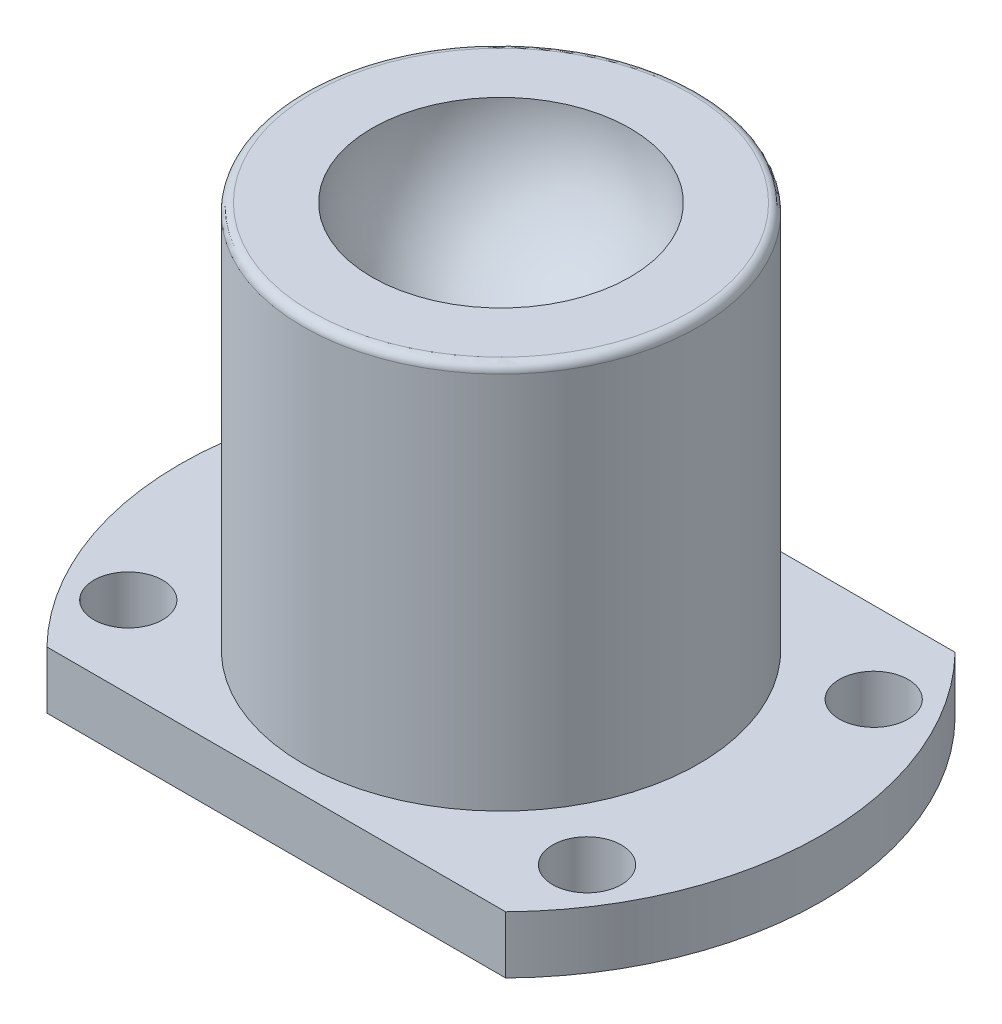
ISO-10303-21;
HEADER;
FILE_DESCRIPTION(('STEP AP214'),'2;1');
FILE_NAME('part.step','',(''),(''),'','','');
FILE_SCHEMA(('AUTOMOTIVE_DESIGN { 1 0 10303 214 1 1 1 1 }'));
ENDSEC;
DATA;
#1=APPLICATION_CONTEXT('core data for automotive mechanical design processes');
#2=APPLICATION_PROTOCOL_DEFINITION('international standard','automotive_design',2000,#1);
#3=PRODUCT_CONTEXT('',#1,'mechanical');
#4=PRODUCT('Part','Part','',(#3));
#5=PRODUCT_RELATED_PRODUCT_CATEGORY('part','',(#4));
#6=PRODUCT_DEFINITION_FORMATION('','',#4);
#7=PRODUCT_DEFINITION_CONTEXT('part definition',#1,'design');
#8=PRODUCT_DEFINITION('design','',#6,#7);
#9=PRODUCT_DEFINITION_SHAPE('','',#8);
#10=(LENGTH_UNIT() NAMED_UNIT(*) SI_UNIT(.MILLI.,.METRE.));
#11=(NAMED_UNIT(*) PLANE_ANGLE_UNIT() SI_UNIT($,.RADIAN.));
#12=(NAMED_UNIT(*) SI_UNIT($,.STERADIAN.) SOLID_ANGLE_UNIT());
#13=UNCERTAINTY_MEASURE_WITH_UNIT(LENGTH_MEASURE(1.E-05),#10,'distance_accuracy_value','');
#14=(GEOMETRIC_REPRESENTATION_CONTEXT(3) GLOBAL_UNCERTAINTY_ASSIGNED_CONTEXT((#13)) GLOBAL_UNIT_ASSIGNED_CONTEXT((#10,
#11,#12)) REPRESENTATION_CONTEXT('',''));
#15=CARTESIAN_POINT('',(0.,0.,0.));
#16=DIRECTION('',(0.,0.,1.));
#17=DIRECTION('',(1.,0.,0.));
#18=AXIS2_PLACEMENT_3D('',#15,#16,#17);
#19=CARTESIAN_POINT('',(0.,2.,0.));
#20=DIRECTION('',(0.,-1.,0.));
#21=DIRECTION('',(0.,0.,-1.));
#22=AXIS2_PLACEMENT_3D('',#19,#20,#21);
#23=CYLINDRICAL_SURFACE('',#22,11.2);
#24=DIRECTION('',(0.,1.,0.));
#25=VECTOR('',#24,1.);
#26=CARTESIAN_POINT('',(-8.00000000000001,0.,7.83836717690617));
#27=LINE('',#26,#25);
#28=CARTESIAN_POINT('',(-8.00000000000001,0.,7.83836717690617));
#29=VERTEX_POINT('',#28);
#30=CARTESIAN_POINT('',(-8.00000000000001,2.,7.83836717690617));
#31=VERTEX_POINT('',#30);
#32=EDGE_CURVE('E60',#29,#31,#27,.T.);
#33=ORIENTED_EDGE('',*,*,#32,.T.);
#34=CARTESIAN_POINT('',(0.,2.,0.));
#35=DIRECTION('',(0.,1.,0.));
#36=DIRECTION('',(0.,0.,1.));
#37=AXIS2_PLACEMENT_3D('',#34,#35,#36);
#38=CIRCLE('',#37,11.2);
#39=CARTESIAN_POINT('',(-8.,2.,-7.83836717690617));
#40=VERTEX_POINT('',#39);
#41=EDGE_CURVE('E104',#40,#31,#38,.T.);
#42=ORIENTED_EDGE('',*,*,#41,.F.);
#43=DIRECTION('',(0.,1.,0.));
#44=VECTOR('',#43,1.);
#45=CARTESIAN_POINT('',(-8.,0.,-7.83836717690617));
#46=LINE('',#45,#44);
#47=CARTESIAN_POINT('',(-8.,0.,-7.83836717690617));
#48=VERTEX_POINT('',#47);
#49=EDGE_CURVE('E141',#48,#40,#46,.T.);
#50=ORIENTED_EDGE('',*,*,#49,.F.);
#51=CARTESIAN_POINT('',(0.,0.,0.));
#52=DIRECTION('',(0.,1.,0.));
#53=DIRECTION('',(0.,0.,1.));
#54=AXIS2_PLACEMENT_3D('',#51,#52,#53);
#55=CIRCLE('',#54,11.2);
#56=EDGE_CURVE('E101',#48,#29,#55,.T.);
#57=ORIENTED_EDGE('',*,*,#56,.T.);
#58=EDGE_LOOP('',(#33,#42,#50,#57));
#59=FACE_BOUND('',#58,.T.);
#60=ADVANCED_FACE('F44',(#59),#23,.T.);
#61=DIRECTION('',(0.,1.,0.));
#62=VECTOR('',#61,1.);
#63=CARTESIAN_POINT('',(8.,0.,7.83836717690617));
#64=LINE('',#63,#62);
#65=CARTESIAN_POINT('',(8.,0.,7.83836717690617));
#66=VERTEX_POINT('',#65);
#67=CARTESIAN_POINT('',(8.,2.,7.83836717690617));
#68=VERTEX_POINT('',#67);
#69=EDGE_CURVE('E86',#66,#68,#64,.T.);
#70=ORIENTED_EDGE('',*,*,#69,.F.);
#71=CARTESIAN_POINT('',(8.,0.,-7.83836717690617));
#72=VERTEX_POINT('',#71);
#73=EDGE_CURVE('E98',#66,#72,#55,.T.);
#74=ORIENTED_EDGE('',*,*,#73,.T.);
#75=DIRECTION('',(0.,1.,0.));
#76=VECTOR('',#75,1.);
#77=CARTESIAN_POINT('',(8.,0.,-7.83836717690617));
#78=LINE('',#77,#76);
#79=CARTESIAN_POINT('',(8.,2.,-7.83836717690617));
#80=VERTEX_POINT('',#79);
#81=EDGE_CURVE('E68',#72,#80,#78,.T.);
#82=ORIENTED_EDGE('',*,*,#81,.T.);
#83=EDGE_CURVE('E100',#68,#80,#38,.T.);
#84=ORIENTED_EDGE('',*,*,#83,.F.);
#85=EDGE_LOOP('',(#70,#74,#82,#84));
#86=FACE_BOUND('',#85,.T.);
#87=ADVANCED_FACE('F97',(#86),#23,.T.);
#88=CARTESIAN_POINT('',(0.,2.,0.));
#89=DIRECTION('',(0.,1.,0.));
#90=DIRECTION('',(0.,0.,1.));
#91=AXIS2_PLACEMENT_3D('',#88,#89,#90);
#92=PLANE('',#91);
#93=CARTESIAN_POINT('',(8.,2.,-5.));
#94=DIRECTION('',(0.,1.,0.));
#95=DIRECTION('',(0.,0.,1.));
#96=AXIS2_PLACEMENT_3D('',#93,#94,#95);
#97=CIRCLE('',#96,1.2);
#98=CARTESIAN_POINT('',(8.,2.,-3.8));
#99=VERTEX_POINT('',#98);
#100=EDGE_CURVE('E170',#99,#99,#97,.T.);
#101=ORIENTED_EDGE('',*,*,#100,.F.);
#102=EDGE_LOOP('',(#101));
#103=FACE_BOUND('',#102,.T.);
#104=CARTESIAN_POINT('',(8.,2.,5.));
#105=DIRECTION('',(0.,1.,0.));
#106=DIRECTION('',(0.,0.,1.));
#107=AXIS2_PLACEMENT_3D('',#104,#105,#106);
#108=CIRCLE('',#107,1.2);
#109=CARTESIAN_POINT('',(8.,2.,6.2));
#110=VERTEX_POINT('',#109);
#111=EDGE_CURVE('E174',#110,#110,#108,.T.);
#112=ORIENTED_EDGE('',*,*,#111,.F.);
#113=EDGE_LOOP('',(#112));
#114=FACE_BOUND('',#113,.T.);
#115=CARTESIAN_POINT('',(-8.,2.,5.));
#116=DIRECTION('',(0.,1.,0.));
#117=DIRECTION('',(0.,0.,1.));
#118=AXIS2_PLACEMENT_3D('',#115,#116,#117);
#119=CIRCLE('',#118,1.2);
#120=CARTESIAN_POINT('',(-8.,2.,6.2));
#121=VERTEX_POINT('',#120);
#122=EDGE_CURVE('E178',#121,#121,#119,.T.);
#123=ORIENTED_EDGE('',*,*,#122,.F.);
#124=EDGE_LOOP('',(#123));
#125=FACE_BOUND('',#124,.T.);
#126=CARTESIAN_POINT('',(-8.,2.,-5.));
#127=DIRECTION('',(0.,1.,0.));
#128=DIRECTION('',(0.,0.,1.));
#129=AXIS2_PLACEMENT_3D('',#126,#127,#128);
#130=CIRCLE('',#129,1.2);
#131=CARTESIAN_POINT('',(-8.,2.,-3.8));
#132=VERTEX_POINT('',#131);
#133=EDGE_CURVE('E114',#132,#132,#130,.T.);
#134=ORIENTED_EDGE('',*,*,#133,.F.);
#135=EDGE_LOOP('',(#134));
#136=FACE_BOUND('',#135,.T.);
#137=CARTESIAN_POINT('',(0.,2.,0.));
#138=DIRECTION('',(0.,1.,0.));
#139=DIRECTION('',(0.,0.,1.));
#140=AXIS2_PLACEMENT_3D('',#137,#138,#139);
#141=CIRCLE('',#140,6.9);
#142=CARTESIAN_POINT('',(0.,2.,6.9));
#143=VERTEX_POINT('',#142);
#144=EDGE_CURVE('E125',#143,#143,#141,.T.);
#145=ORIENTED_EDGE('',*,*,#144,.F.);
#146=EDGE_LOOP('',(#145));
#147=FACE_BOUND('',#146,.T.);
#148=ORIENTED_EDGE('',*,*,#41,.T.);
#149=DIRECTION('',(1.,0.,0.));
#150=VECTOR('',#149,1.);
#151=CARTESIAN_POINT('',(-8.,2.,7.83836717690617));
#152=LINE('',#151,#150);
#153=EDGE_CURVE('E135',#31,#68,#152,.T.);
#154=ORIENTED_EDGE('',*,*,#153,.T.);
#155=ORIENTED_EDGE('',*,*,#83,.T.);
#156=DIRECTION('',(-1.,0.,0.));
#157=VECTOR('',#156,1.);
#158=CARTESIAN_POINT('',(-8.,2.,-7.83836717690617));
#159=LINE('',#158,#157);
#160=EDGE_CURVE('E123',#80,#40,#159,.T.);
#161=ORIENTED_EDGE('',*,*,#160,.T.);
#162=EDGE_LOOP('',(#148,#154,#155,#161));
#163=FACE_BOUND('',#162,.T.);
#164=ADVANCED_FACE('F143',(#103,#114,#125,#136,#147,#163),#92,.T.);
#165=CARTESIAN_POINT('',(0.,0.,0.));
#166=DIRECTION('',(0.,1.,0.));
#167=DIRECTION('',(0.,0.,1.));
#168=AXIS2_PLACEMENT_3D('',#165,#166,#167);
#169=PLANE('',#168);
#170=CARTESIAN_POINT('',(8.,0.,-5.));
#171=DIRECTION('',(0.,1.,0.));
#172=DIRECTION('',(0.,0.,1.));
#173=AXIS2_PLACEMENT_3D('',#170,#171,#172);
#174=CIRCLE('',#173,1.2);
#175=CARTESIAN_POINT('',(8.,0.,-3.8));
#176=VERTEX_POINT('',#175);
#177=EDGE_CURVE('E120',#176,#176,#174,.T.);
#178=ORIENTED_EDGE('',*,*,#177,.T.);
#179=EDGE_LOOP('',(#178));
#180=FACE_BOUND('',#179,.T.);
#181=CARTESIAN_POINT('',(8.,0.,5.));
#182=DIRECTION('',(0.,1.,0.));
#183=DIRECTION('',(0.,0.,1.));
#184=AXIS2_PLACEMENT_3D('',#181,#182,#183);
#185=CIRCLE('',#184,1.2);
#186=CARTESIAN_POINT('',(8.,0.,6.2));
#187=VERTEX_POINT('',#186);
#188=EDGE_CURVE('E117',#187,#187,#185,.T.);
#189=ORIENTED_EDGE('',*,*,#188,.T.);
#190=EDGE_LOOP('',(#189));
#191=FACE_BOUND('',#190,.T.);
#192=CARTESIAN_POINT('',(-8.,0.,5.));
#193=DIRECTION('',(0.,1.,0.));
#194=DIRECTION('',(0.,0.,1.));
#195=AXIS2_PLACEMENT_3D('',#192,#193,#194);
#196=CIRCLE('',#195,1.2);
#197=CARTESIAN_POINT('',(-8.,0.,6.2));
#198=VERTEX_POINT('',#197);
#199=EDGE_CURVE('E113',#198,#198,#196,.T.);
#200=ORIENTED_EDGE('',*,*,#199,.T.);
#201=EDGE_LOOP('',(#200));
#202=FACE_BOUND('',#201,.T.);
#203=CARTESIAN_POINT('',(-8.,0.,-5.));
#204=DIRECTION('',(0.,1.,0.));
#205=DIRECTION('',(0.,0.,1.));
#206=AXIS2_PLACEMENT_3D('',#203,#204,#205);
#207=CIRCLE('',#206,1.2);
#208=CARTESIAN_POINT('',(-8.,0.,-3.8));
#209=VERTEX_POINT('',#208);
#210=EDGE_CURVE('E110',#209,#209,#207,.T.);
#211=ORIENTED_EDGE('',*,*,#210,.T.);
#212=EDGE_LOOP('',(#211));
#213=FACE_BOUND('',#212,.T.);
#214=DIRECTION('',(1.,0.,0.));
#215=VECTOR('',#214,1.);
#216=CARTESIAN_POINT('',(-8.,0.,7.83836717690617));
#217=LINE('',#216,#215);
#218=EDGE_CURVE('E83',#29,#66,#217,.T.);
#219=ORIENTED_EDGE('',*,*,#218,.F.);
#220=ORIENTED_EDGE('',*,*,#56,.F.);
#221=DIRECTION('',(-1.,0.,0.));
#222=VECTOR('',#221,1.);
#223=CARTESIAN_POINT('',(-8.,0.,-7.83836717690617));
#224=LINE('',#223,#222);
#225=EDGE_CURVE('E92',#72,#48,#224,.T.);
#226=ORIENTED_EDGE('',*,*,#225,.F.);
#227=ORIENTED_EDGE('',*,*,#73,.F.);
#228=EDGE_LOOP('',(#219,#220,#226,#227));
#229=FACE_BOUND('',#228,.T.);
#230=ADVANCED_FACE('F103',(#180,#191,#202,#213,#229),#169,.F.);
#231=CARTESIAN_POINT('',(-8.,0.,-7.83836717690617));
#232=DIRECTION('',(0.,0.,-1.));
#233=DIRECTION('',(-1.,0.,0.));
#234=AXIS2_PLACEMENT_3D('',#231,#232,#233);
#235=PLANE('',#234);
#236=ORIENTED_EDGE('',*,*,#160,.F.);
#237=ORIENTED_EDGE('',*,*,#81,.F.);
#238=ORIENTED_EDGE('',*,*,#225,.T.);
#239=ORIENTED_EDGE('',*,*,#49,.T.);
#240=EDGE_LOOP('',(#236,#237,#238,#239));
#241=FACE_BOUND('',#240,.T.);
#242=ADVANCED_FACE('F147',(#241),#235,.T.);
#243=CARTESIAN_POINT('',(-8.,0.,7.83836717690617));
#244=DIRECTION('',(0.,0.,1.));
#245=DIRECTION('',(1.,0.,0.));
#246=AXIS2_PLACEMENT_3D('',#243,#244,#245);
#247=PLANE('',#246);
#248=ORIENTED_EDGE('',*,*,#153,.F.);
#249=ORIENTED_EDGE('',*,*,#32,.F.);
#250=ORIENTED_EDGE('',*,*,#218,.T.);
#251=ORIENTED_EDGE('',*,*,#69,.T.);
#252=EDGE_LOOP('',(#248,#249,#250,#251));
#253=FACE_BOUND('',#252,.T.);
#254=ADVANCED_FACE('F85',(#253),#247,.T.);
#255=CARTESIAN_POINT('',(0.,15.5,0.));
#256=DIRECTION('',(0.,-1.,0.));
#257=DIRECTION('',(0.,0.,-1.));
#258=AXIS2_PLACEMENT_3D('',#255,#256,#257);
#259=CYLINDRICAL_SURFACE('',#258,6.9);
#260=CARTESIAN_POINT('',(0.,15.2,0.));
#261=DIRECTION('',(0.,1.,0.));
#262=DIRECTION('',(0.,0.,1.));
#263=AXIS2_PLACEMENT_3D('',#260,#261,#262);
#264=CIRCLE('',#263,6.9);
#265=CARTESIAN_POINT('',(0.,15.2,6.9));
#266=VERTEX_POINT('',#265);
#267=EDGE_CURVE('E12',#266,#266,#264,.F.);
#268=ORIENTED_EDGE('',*,*,#267,.T.);
#269=EDGE_LOOP('',(#268));
#270=FACE_BOUND('',#269,.T.);
#271=ORIENTED_EDGE('',*,*,#144,.T.);
#272=EDGE_LOOP('',(#271));
#273=FACE_BOUND('',#272,.T.);
#274=ADVANCED_FACE('F154',(#270,#273),#259,.T.);
#275=CARTESIAN_POINT('',(0.,15.5,0.));
#276=DIRECTION('',(0.,1.,0.));
#277=DIRECTION('',(0.,0.,1.));
#278=AXIS2_PLACEMENT_3D('',#275,#276,#277);
#279=PLANE('',#278);
#280=CARTESIAN_POINT('',(0.,15.5,0.));
#281=DIRECTION('',(0.,1.,0.));
#282=DIRECTION('',(0.,0.,1.));
#283=AXIS2_PLACEMENT_3D('',#280,#281,#282);
#284=CIRCLE('',#283,4.5);
#285=CARTESIAN_POINT('',(0.,15.5,4.5));
#286=VERTEX_POINT('',#285);
#287=EDGE_CURVE('E48',#286,#286,#284,.T.);
#288=ORIENTED_EDGE('',*,*,#287,.F.);
#289=EDGE_LOOP('',(#288));
#290=FACE_BOUND('',#289,.T.);
#291=CARTESIAN_POINT('',(0.,15.5,0.));
#292=DIRECTION('',(0.,1.,0.));
#293=DIRECTION('',(0.,0.,1.));
#294=AXIS2_PLACEMENT_3D('',#291,#292,#293);
#295=CIRCLE('',#294,6.6);
#296=CARTESIAN_POINT('',(0.,15.5,6.6));
#297=VERTEX_POINT('',#296);
#298=EDGE_CURVE('E53',#297,#297,#295,.T.);
#299=ORIENTED_EDGE('',*,*,#298,.T.);
#300=EDGE_LOOP('',(#299));
#301=FACE_BOUND('',#300,.T.);
#302=ADVANCED_FACE('F192',(#290,#301),#279,.T.);
#303=CARTESIAN_POINT('',(-8.,-11.5,-5.));
#304=DIRECTION('',(0.,1.,0.));
#305=DIRECTION('',(0.,0.,1.));
#306=AXIS2_PLACEMENT_3D('',#303,#304,#305);
#307=CYLINDRICAL_SURFACE('',#306,1.2);
#308=ORIENTED_EDGE('',*,*,#133,.T.);
#309=EDGE_LOOP('',(#308));
#310=FACE_BOUND('',#309,.T.);
#311=ORIENTED_EDGE('',*,*,#210,.F.);
#312=EDGE_LOOP('',(#311));
#313=FACE_BOUND('',#312,.T.);
#314=ADVANCED_FACE('F194',(#310,#313),#307,.F.);
#315=CARTESIAN_POINT('',(-8.,-11.5,5.));
#316=DIRECTION('',(0.,1.,0.));
#317=DIRECTION('',(0.,0.,1.));
#318=AXIS2_PLACEMENT_3D('',#315,#316,#317);
#319=CYLINDRICAL_SURFACE('',#318,1.2);
#320=ORIENTED_EDGE('',*,*,#122,.T.);
#321=EDGE_LOOP('',(#320));
#322=FACE_BOUND('',#321,.T.);
#323=ORIENTED_EDGE('',*,*,#199,.F.);
#324=EDGE_LOOP('',(#323));
#325=FACE_BOUND('',#324,.T.);
#326=ADVANCED_FACE('F200',(#322,#325),#319,.F.);
#327=CARTESIAN_POINT('',(8.,-11.5,5.));
#328=DIRECTION('',(0.,1.,0.));
#329=DIRECTION('',(0.,0.,1.));
#330=AXIS2_PLACEMENT_3D('',#327,#328,#329);
#331=CYLINDRICAL_SURFACE('',#330,1.2);
#332=ORIENTED_EDGE('',*,*,#111,.T.);
#333=EDGE_LOOP('',(#332));
#334=FACE_BOUND('',#333,.T.);
#335=ORIENTED_EDGE('',*,*,#188,.F.);
#336=EDGE_LOOP('',(#335));
#337=FACE_BOUND('',#336,.T.);
#338=ADVANCED_FACE('F208',(#334,#337),#331,.F.);
#339=CARTESIAN_POINT('',(8.,-11.5,-5.));
#340=DIRECTION('',(0.,1.,0.));
#341=DIRECTION('',(0.,0.,1.));
#342=AXIS2_PLACEMENT_3D('',#339,#340,#341);
#343=CYLINDRICAL_SURFACE('',#342,1.2);
#344=ORIENTED_EDGE('',*,*,#100,.T.);
#345=EDGE_LOOP('',(#344));
#346=FACE_BOUND('',#345,.T.);
#347=ORIENTED_EDGE('',*,*,#177,.F.);
#348=EDGE_LOOP('',(#347));
#349=FACE_BOUND('',#348,.T.);
#350=ADVANCED_FACE('F205',(#346,#349),#343,.F.);
#351=CARTESIAN_POINT('',(0.,15.2,0.));
#352=DIRECTION('',(0.,1.,0.));
#353=DIRECTION('',(0.,0.,1.));
#354=AXIS2_PLACEMENT_3D('',#351,#352,#353);
#355=TOROIDAL_SURFACE('',#354,6.6,0.3);
#356=ORIENTED_EDGE('',*,*,#267,.F.);
#357=EDGE_LOOP('',(#356));
#358=FACE_BOUND('',#357,.T.);
#359=ORIENTED_EDGE('',*,*,#298,.F.);
#360=EDGE_LOOP('',(#359));
#361=FACE_BOUND('',#360,.T.);
#362=ADVANCED_FACE('F46',(#358,#361),#355,.T.);
#363=CARTESIAN_POINT('',(0.,15.5,0.));
#364=DIRECTION('',(0.,0.,1.));
#365=DIRECTION('',(1.,0.,0.));
#366=AXIS2_PLACEMENT_3D('',#363,#364,#365);
#367=SPHERICAL_SURFACE('',#366,4.5);
#368=CARTESIAN_POINT('',(0.,15.5,0.));
#369=DIRECTION('',(0.,1.,0.));
#370=DIRECTION('',(0.,0.,1.));
#371=AXIS2_PLACEMENT_3D('',#368,#369,#370);
#372=SPHERICAL_SURFACE('',#371,4.5);
#373=ORIENTED_EDGE('',*,*,#287,.T.);
#374=EDGE_LOOP('',(#373));
#375=FACE_BOUND('',#374,.T.);
#376=ADVANCED_FACE('F190',(#375),#372,.F.);
#377=CLOSED_SHELL('',(#60,#87,#164,#230,#242,#254,#274,#302,#314,#326,#338,#350,#362,#376));
#378=MANIFOLD_SOLID_BREP('B2',#377);
#379=ADVANCED_BREP_SHAPE_REPRESENTATION('',(#18,#378),#14);
#380=SHAPE_DEFINITION_REPRESENTATION(#9,#379);
ENDSEC;
END-ISO-10303-21;
